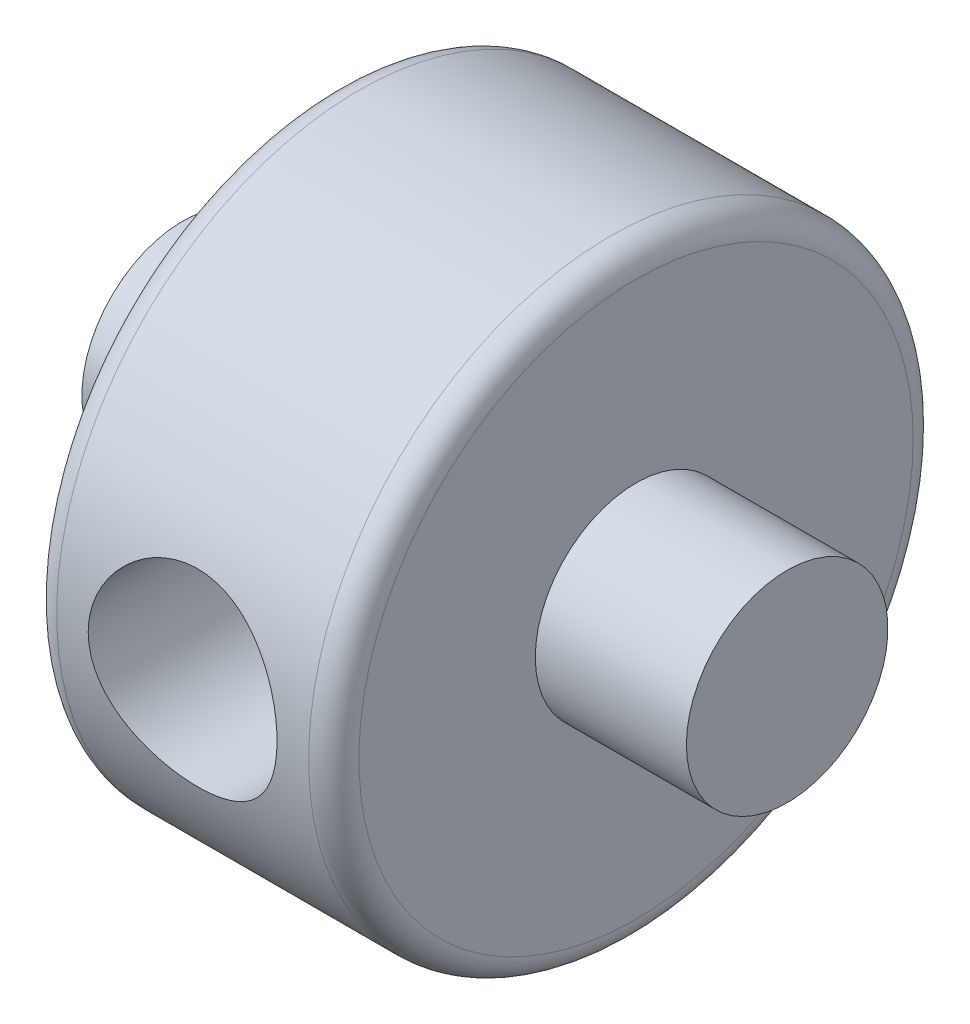
ISO-10303-21;
HEADER;
FILE_DESCRIPTION(('STEP AP214'),'2;1');
FILE_NAME('part.step','',(''),(''),'','','');
FILE_SCHEMA(('AUTOMOTIVE_DESIGN { 1 0 10303 214 1 1 1 1 }'));
ENDSEC;
DATA;
#1=APPLICATION_CONTEXT('core data for automotive mechanical design processes');
#2=APPLICATION_PROTOCOL_DEFINITION('international standard','automotive_design',2000,#1);
#3=PRODUCT_CONTEXT('',#1,'mechanical');
#4=PRODUCT('Part','Part','',(#3));
#5=PRODUCT_RELATED_PRODUCT_CATEGORY('part','',(#4));
#6=PRODUCT_DEFINITION_FORMATION('','',#4);
#7=PRODUCT_DEFINITION_CONTEXT('part definition',#1,'design');
#8=PRODUCT_DEFINITION('design','',#6,#7);
#9=PRODUCT_DEFINITION_SHAPE('','',#8);
#10=(LENGTH_UNIT() NAMED_UNIT(*) SI_UNIT(.MILLI.,.METRE.));
#11=(NAMED_UNIT(*) PLANE_ANGLE_UNIT() SI_UNIT($,.RADIAN.));
#12=(NAMED_UNIT(*) SI_UNIT($,.STERADIAN.) SOLID_ANGLE_UNIT());
#13=UNCERTAINTY_MEASURE_WITH_UNIT(LENGTH_MEASURE(1.E-05),#10,'distance_accuracy_value','');
#14=(GEOMETRIC_REPRESENTATION_CONTEXT(3) GLOBAL_UNCERTAINTY_ASSIGNED_CONTEXT((#13)) GLOBAL_UNIT_ASSIGNED_CONTEXT((#10,
#11,#12)) REPRESENTATION_CONTEXT('',''));
#15=CARTESIAN_POINT('',(0.,0.,0.));
#16=DIRECTION('',(0.,0.,1.));
#17=DIRECTION('',(1.,0.,0.));
#18=AXIS2_PLACEMENT_3D('',#15,#16,#17);
#19=CARTESIAN_POINT('',(4.7625,0.,0.));
#20=DIRECTION('',(-1.,0.,0.));
#21=DIRECTION('',(0.,0.,1.));
#22=AXIS2_PLACEMENT_3D('',#19,#20,#21);
#23=CYLINDRICAL_SURFACE('',#22,9.525);
#24=CARTESIAN_POINT('',(-3.97002,0.,0.));
#25=DIRECTION('',(1.,0.,0.));
#26=DIRECTION('',(0.,0.,-1.));
#27=AXIS2_PLACEMENT_3D('',#24,#25,#26);
#28=CIRCLE('',#27,9.525);
#29=CARTESIAN_POINT('',(-3.97002,0.,-9.525));
#30=VERTEX_POINT('',#29);
#31=EDGE_CURVE('E66',#30,#30,#28,.T.);
#32=ORIENTED_EDGE('',*,*,#31,.T.);
#33=EDGE_LOOP('',(#32));
#34=FACE_BOUND('',#33,.T.);
#35=CARTESIAN_POINT('',(3.97002,0.,0.));
#36=DIRECTION('',(1.,0.,0.));
#37=DIRECTION('',(0.,0.,-1.));
#38=AXIS2_PLACEMENT_3D('',#35,#36,#37);
#39=CIRCLE('',#38,9.525);
#40=CARTESIAN_POINT('',(3.97002,0.,-9.525));
#41=VERTEX_POINT('',#40);
#42=EDGE_CURVE('E70',#41,#41,#39,.F.);
#43=ORIENTED_EDGE('',*,*,#42,.T.);
#44=EDGE_LOOP('',(#43));
#45=FACE_BOUND('',#44,.T.);
#46=CARTESIAN_POINT('',(-2.97561,0.,9.525));
#47=CARTESIAN_POINT('',(-2.97560892908899,-0.162921268693524,9.5249991825274));
#48=CARTESIAN_POINT('',(-2.96218545551913,-0.325853755817803,9.5207804866991));
#49=CARTESIAN_POINT('',(-2.9089868638568,-0.64695408256915,9.5043645830204));
#50=CARTESIAN_POINT('',(-2.86920576572283,-0.805120832425698,9.49216556459521));
#51=CARTESIAN_POINT('',(-2.76476421151836,-1.1120129201775,9.46112170079366));
#52=CARTESIAN_POINT('',(-2.7001422506502,-1.26075245376864,9.44228714208394));
#53=CARTESIAN_POINT('',(-2.54801708251173,-1.54528445019378,9.39991699927325));
#54=CARTESIAN_POINT('',(-2.46051027418793,-1.68107487082232,9.37638067546209));
#55=CARTESIAN_POINT('',(-2.26225609825942,-1.94004612503259,9.326292844634));
#56=CARTESIAN_POINT('',(-2.15092999331535,-2.06277116216999,9.29967567946985));
#57=CARTESIAN_POINT('',(-1.9094296343454,-2.28814818724141,9.24680648901886));
#58=CARTESIAN_POINT('',(-1.77925188196652,-2.39079644114151,9.22055453249807));
#59=CARTESIAN_POINT('',(-1.49979833405859,-2.57557701781646,9.17068363841349));
#60=CARTESIAN_POINT('',(-1.35013027047282,-2.65714004001138,9.14714574209272));
#61=CARTESIAN_POINT('',(-1.03834767478036,-2.79374911714824,9.10635549526321));
#62=CARTESIAN_POINT('',(-0.876236432006404,-2.84880215216098,9.08910149049978));
#63=CARTESIAN_POINT('',(-0.549312310322734,-2.92916088653537,9.06351935862837));
#64=CARTESIAN_POINT('',(-0.384727596585018,-2.95531204167687,9.05493821293298));
#65=CARTESIAN_POINT('',(-0.0533002371303596,-2.97976597917009,9.0469221577123));
#66=CARTESIAN_POINT('',(0.1135417969822,-2.97807615961433,9.04748481843225));
#67=CARTESIAN_POINT('',(0.437755018688408,-2.94755740100725,9.05746945847797));
#68=CARTESIAN_POINT('',(0.595239987861666,-2.91980310528962,9.06654061304928));
#69=CARTESIAN_POINT('',(0.903195753586682,-2.83968557156473,9.09195024490162));
#70=CARTESIAN_POINT('',(1.05366580325522,-2.78731971969601,9.10828949407816));
#71=CARTESIAN_POINT('',(1.34588103762239,-2.65870635431721,9.14666326425695));
#72=CARTESIAN_POINT('',(1.48746675040612,-2.58212130582152,9.16877745919686));
#73=CARTESIAN_POINT('',(1.75612984594173,-2.40747793818329,9.21617289096187));
#74=CARTESIAN_POINT('',(1.88320344888501,-2.30941404400202,9.24145494930564));
#75=CARTESIAN_POINT('',(2.12531069615131,-2.08932283958016,9.29374498729017));
#76=CARTESIAN_POINT('',(2.23953365697596,-1.96640834370661,9.32077916124985));
#77=CARTESIAN_POINT('',(2.44594281593567,-1.70283268275949,9.37251295885174));
#78=CARTESIAN_POINT('',(2.53812738356181,-1.56217020577834,9.39721240967794));
#79=CARTESIAN_POINT('',(2.69839182978221,-1.26552983986233,9.44175288357981));
#80=CARTESIAN_POINT('',(2.76627845541765,-1.10944123981617,9.46155458459764));
#81=CARTESIAN_POINT('',(2.87459049380546,-0.787297276370402,9.4937845850159));
#82=CARTESIAN_POINT('',(2.91502423947373,-0.621244953982465,9.50621512167911));
#83=CARTESIAN_POINT('',(2.96590203079995,-0.290768535460987,9.52194225762391));
#84=CARTESIAN_POINT('',(2.97744355636338,-0.126529051992868,9.52557294304818));
#85=CARTESIAN_POINT('',(2.97330347449539,0.201557483831692,9.52427930671778));
#86=CARTESIAN_POINT('',(2.95762584105002,0.365404589977774,9.51935623380823));
#87=CARTESIAN_POINT('',(2.90037356088732,0.683822935801493,9.50172775701694));
#88=CARTESIAN_POINT('',(2.85945185430202,0.838523489496811,9.48921869933119));
#89=CARTESIAN_POINT('',(2.75366967613841,1.1388197218032,9.45788170767091));
#90=CARTESIAN_POINT('',(2.68880624862798,1.28441427355727,9.43905299347461));
#91=CARTESIAN_POINT('',(2.53521465690171,1.56631197910014,9.39644202198593));
#92=CARTESIAN_POINT('',(2.44594343349672,1.70230223515319,9.37255022960303));
#93=CARTESIAN_POINT('',(2.24672195616173,1.95774025593457,9.32254508924183));
#94=CARTESIAN_POINT('',(2.13676609718477,2.07718352155072,9.29643114016449));
#95=CARTESIAN_POINT('',(1.89413482281894,2.30104645806901,9.24362343594829));
#96=CARTESIAN_POINT('',(1.76073217446023,2.40468394628017,9.21694766782538));
#97=CARTESIAN_POINT('',(1.47784950027834,2.58817177210595,9.16711857929308));
#98=CARTESIAN_POINT('',(1.32836973137667,2.66802248976982,9.14396520260813));
#99=CARTESIAN_POINT('',(1.01788607945972,2.8011734002445,9.10405924250885));
#100=CARTESIAN_POINT('',(0.856929737003459,2.85457658511119,9.08728188993928));
#101=CARTESIAN_POINT('',(0.527677948818312,2.93333159164955,9.0621704134104));
#102=CARTESIAN_POINT('',(0.359385318814466,2.95869407873132,9.05383307935257));
#103=CARTESIAN_POINT('',(0.0284146185817938,2.97988222921441,9.04687995933718));
#104=CARTESIAN_POINT('',(-0.134173453040671,2.97699099324848,9.04784184137313));
#105=CARTESIAN_POINT('',(-0.456426000800429,2.94485093082836,9.05835290591848));
#106=CARTESIAN_POINT('',(-0.61609061280295,2.91560333245156,9.06790168832033));
#107=CARTESIAN_POINT('',(-0.925671104369186,2.83243941969344,9.0942156377694));
#108=CARTESIAN_POINT('',(-1.07569539009698,2.77889004918722,9.11087324977955));
#109=CARTESIAN_POINT('',(-1.36474955060592,2.64893161193132,9.1495005696249));
#110=CARTESIAN_POINT('',(-1.50377718271353,2.57251789731425,9.17147135734895));
#111=CARTESIAN_POINT('',(-1.77277605014682,2.39550550144522,9.21932128510671));
#112=CARTESIAN_POINT('',(-1.90218062857498,2.29407800552668,9.24531965309969));
#113=CARTESIAN_POINT('',(-2.14254825469236,2.07137589462194,9.29774676632117));
#114=CARTESIAN_POINT('',(-2.25350635485266,1.95009597227206,9.32417562493132));
#115=CARTESIAN_POINT('',(-2.45745487752511,1.68637097013274,9.37552022631019));
#116=CARTESIAN_POINT('',(-2.54974101061028,1.54336447092973,9.40035847417778));
#117=CARTESIAN_POINT('',(-2.70884066788852,1.24309174405794,9.44475128447266));
#118=CARTESIAN_POINT('',(-2.77566422147912,1.08583116117471,9.46430792637385));
#119=CARTESIAN_POINT('',(-2.87707971583138,0.775274088322703,9.49456798015985));
#120=CARTESIAN_POINT('',(-2.91392217405338,0.622769930704498,9.50588093250502));
#121=CARTESIAN_POINT('',(-2.96318536416659,0.313513400907386,9.52109658709757));
#122=CARTESIAN_POINT('',(-2.97561103042432,0.156761893564039,9.52500078656737));
#123=CARTESIAN_POINT('',(-2.97561,0.,9.525));
#124=B_SPLINE_CURVE_WITH_KNOTS('',3,(#46,#47,#48,#49,#50,#51,#52,#53,#54,#55,#56,#57,#58,#59,
#60,#61,#62,#63,#64,#65,#66,#67,#68,#69,#70,#71,#72,#73,#74,#75,#76,#77,#78,#79,#80,#81,#82,#83,
#84,#85,#86,#87,#88,#89,#90,#91,#92,#93,#94,#95,#96,#97,#98,#99,#100,#101,#102,#103,#104,#105,
#106,#107,#108,#109,#110,#111,#112,#113,#114,#115,#116,#117,#118,#119,#120,#121,#122,#123),
.UNSPECIFIED.,.T.,.F.,(4,2,2,2,2,2,2,2,2,2,2,2,2,2,2,2,2,2,2,2,2,2,2,2,2,2,2,2,2,2,2,2,2,2,2,2,
2,2,4),(0.,0.48818760348454,0.976486005355122,1.46403073545406,1.95165222953998,
2.45283699364851,2.95411488348424,3.46777301296802,3.9812958223854,4.47936276908504,
4.97729736819423,5.45556333934905,5.93388011605119,6.41918085331817,6.90460770459774,
7.412117184402,7.91966420064632,8.43116268893267,8.9425058499212,9.4341088402017,
9.92564006268288,10.4049619292838,10.8843429945151,11.3754065240728,11.8666033124105,
12.3772503337256,12.8878891958236,13.3965235759112,13.9049644279144,14.3904265009165,
14.8758659549335,15.3542076044564,15.8326465574799,16.3297925923838,16.8270717524275,
17.3405744711146,17.8538747177861,18.3237009362114,18.7934321981296),.UNSPECIFIED.);
#125=CARTESIAN_POINT('',(-2.97561,0.,9.525));
#126=VERTEX_POINT('',#125);
#127=EDGE_CURVE('E10',#126,#126,#124,.T.);
#128=ORIENTED_EDGE('',*,*,#127,.F.);
#129=EDGE_LOOP('',(#128));
#130=FACE_BOUND('',#129,.T.);
#131=ADVANCED_FACE('F37',(#34,#45,#130),#23,.T.);
#132=CARTESIAN_POINT('',(4.7625,0.,0.));
#133=DIRECTION('',(1.,0.,0.));
#134=DIRECTION('',(0.,0.,-1.));
#135=AXIS2_PLACEMENT_3D('',#132,#133,#134);
#136=PLANE('',#135);
#137=CARTESIAN_POINT('',(4.7625,0.,0.));
#138=DIRECTION('',(1.,0.,0.));
#139=DIRECTION('',(0.,0.,-1.));
#140=AXIS2_PLACEMENT_3D('',#137,#138,#139);
#141=CIRCLE('',#140,8.73252);
#142=CARTESIAN_POINT('',(4.7625,0.,-8.73252));
#143=VERTEX_POINT('',#142);
#144=EDGE_CURVE('E55',#143,#143,#141,.T.);
#145=ORIENTED_EDGE('',*,*,#144,.T.);
#146=EDGE_LOOP('',(#145));
#147=FACE_BOUND('',#146,.T.);
#148=CARTESIAN_POINT('',(4.7625,0.,0.));
#149=DIRECTION('',(1.,0.,0.));
#150=DIRECTION('',(0.,0.,-1.));
#151=AXIS2_PLACEMENT_3D('',#148,#149,#150);
#152=CIRCLE('',#151,3.175);
#153=CARTESIAN_POINT('',(4.7625,0.,3.175));
#154=VERTEX_POINT('',#153);
#155=EDGE_CURVE('E74',#154,#154,#152,.T.);
#156=ORIENTED_EDGE('',*,*,#155,.F.);
#157=EDGE_LOOP('',(#156));
#158=FACE_BOUND('',#157,.T.);
#159=ADVANCED_FACE('F106',(#147,#158),#136,.T.);
#160=CARTESIAN_POINT('',(-4.7625,0.,0.));
#161=DIRECTION('',(1.,0.,0.));
#162=DIRECTION('',(0.,0.,-1.));
#163=AXIS2_PLACEMENT_3D('',#160,#161,#162);
#164=PLANE('',#163);
#165=CARTESIAN_POINT('',(-4.7625,0.,0.));
#166=DIRECTION('',(1.,0.,0.));
#167=DIRECTION('',(0.,0.,-1.));
#168=AXIS2_PLACEMENT_3D('',#165,#166,#167);
#169=CIRCLE('',#168,3.175);
#170=CARTESIAN_POINT('',(-4.7625,0.,-3.175));
#171=VERTEX_POINT('',#170);
#172=EDGE_CURVE('E50',#171,#171,#169,.F.);
#173=ORIENTED_EDGE('',*,*,#172,.F.);
#174=EDGE_LOOP('',(#173));
#175=FACE_BOUND('',#174,.T.);
#176=CARTESIAN_POINT('',(-4.7625,0.,0.));
#177=DIRECTION('',(1.,0.,0.));
#178=DIRECTION('',(0.,0.,-1.));
#179=AXIS2_PLACEMENT_3D('',#176,#177,#178);
#180=CIRCLE('',#179,8.73252);
#181=CARTESIAN_POINT('',(-4.7625,0.,-8.73252));
#182=VERTEX_POINT('',#181);
#183=EDGE_CURVE('E60',#182,#182,#180,.F.);
#184=ORIENTED_EDGE('',*,*,#183,.T.);
#185=EDGE_LOOP('',(#184));
#186=FACE_BOUND('',#185,.T.);
#187=ADVANCED_FACE('F111',(#175,#186),#164,.F.);
#188=CARTESIAN_POINT('',(9.525,0.,0.));
#189=DIRECTION('',(-1.,0.,0.));
#190=DIRECTION('',(0.,0.,1.));
#191=AXIS2_PLACEMENT_3D('',#188,#189,#190);
#192=CYLINDRICAL_SURFACE('',#191,3.175);
#193=CARTESIAN_POINT('',(9.525,0.,0.));
#194=DIRECTION('',(1.,0.,0.));
#195=DIRECTION('',(0.,0.,-1.));
#196=AXIS2_PLACEMENT_3D('',#193,#194,#195);
#197=CIRCLE('',#196,3.175);
#198=CARTESIAN_POINT('',(9.525,0.,3.175));
#199=VERTEX_POINT('',#198);
#200=EDGE_CURVE('E78',#199,#199,#197,.T.);
#201=CARTESIAN_POINT('',(9.525,0.,3.175));
#202=CARTESIAN_POINT('',(9.475390625,0.,3.175));
#203=CARTESIAN_POINT('',(9.42578125,0.,3.175));
#204=CARTESIAN_POINT('',(9.3265625,0.,3.175));
#205=CARTESIAN_POINT('',(9.276953125,0.,3.175));
#206=CARTESIAN_POINT('',(9.177734375,0.,3.175));
#207=CARTESIAN_POINT('',(9.128125,0.,3.175));
#208=CARTESIAN_POINT('',(9.02890625,0.,3.175));
#209=CARTESIAN_POINT('',(8.979296875,0.,3.175));
#210=CARTESIAN_POINT('',(8.880078125,0.,3.175));
#211=CARTESIAN_POINT('',(8.83046875,0.,3.175));
#212=CARTESIAN_POINT('',(8.73125,0.,3.175));
#213=CARTESIAN_POINT('',(8.681640625,0.,3.175));
#214=CARTESIAN_POINT('',(8.582421875,0.,3.175));
#215=CARTESIAN_POINT('',(8.5328125,0.,3.175));
#216=CARTESIAN_POINT('',(8.43359375,0.,3.175));
#217=CARTESIAN_POINT('',(8.383984375,0.,3.175));
#218=CARTESIAN_POINT('',(8.284765625,0.,3.175));
#219=CARTESIAN_POINT('',(8.23515625,0.,3.175));
#220=CARTESIAN_POINT('',(8.1359375,0.,3.175));
#221=CARTESIAN_POINT('',(8.086328125,0.,3.175));
#222=CARTESIAN_POINT('',(7.987109375,0.,3.175));
#223=CARTESIAN_POINT('',(7.9375,0.,3.175));
#224=CARTESIAN_POINT('',(7.83828125,0.,3.175));
#225=CARTESIAN_POINT('',(7.788671875,0.,3.175));
#226=CARTESIAN_POINT('',(7.689453125,0.,3.175));
#227=CARTESIAN_POINT('',(7.63984375,0.,3.175));
#228=CARTESIAN_POINT('',(7.540625,0.,3.175));
#229=CARTESIAN_POINT('',(7.491015625,0.,3.175));
#230=CARTESIAN_POINT('',(7.391796875,0.,3.175));
#231=CARTESIAN_POINT('',(7.3421875,0.,3.175));
#232=CARTESIAN_POINT('',(7.24296875,0.,3.175));
#233=CARTESIAN_POINT('',(7.193359375,0.,3.175));
#234=CARTESIAN_POINT('',(7.094140625,0.,3.175));
#235=CARTESIAN_POINT('',(7.04453125,0.,3.175));
#236=CARTESIAN_POINT('',(6.9453125,0.,3.175));
#237=CARTESIAN_POINT('',(6.895703125,0.,3.175));
#238=CARTESIAN_POINT('',(6.796484375,0.,3.175));
#239=CARTESIAN_POINT('',(6.746875,0.,3.175));
#240=CARTESIAN_POINT('',(6.64765625,0.,3.175));
#241=CARTESIAN_POINT('',(6.598046875,0.,3.175));
#242=CARTESIAN_POINT('',(6.498828125,0.,3.175));
#243=CARTESIAN_POINT('',(6.44921875,0.,3.175));
#244=CARTESIAN_POINT('',(6.35,0.,3.175));
#245=CARTESIAN_POINT('',(6.300390625,0.,3.175));
#246=CARTESIAN_POINT('',(6.201171875,0.,3.175));
#247=CARTESIAN_POINT('',(6.1515625,0.,3.175));
#248=CARTESIAN_POINT('',(6.05234375,0.,3.175));
#249=CARTESIAN_POINT('',(6.002734375,0.,3.175));
#250=CARTESIAN_POINT('',(5.903515625,0.,3.175));
#251=CARTESIAN_POINT('',(5.85390625,0.,3.175));
#252=CARTESIAN_POINT('',(5.7546875,0.,3.175));
#253=CARTESIAN_POINT('',(5.705078125,0.,3.175));
#254=CARTESIAN_POINT('',(5.605859375,0.,3.175));
#255=CARTESIAN_POINT('',(5.55625,0.,3.175));
#256=CARTESIAN_POINT('',(5.45703125,0.,3.175));
#257=CARTESIAN_POINT('',(5.407421875,0.,3.175));
#258=CARTESIAN_POINT('',(5.308203125,0.,3.175));
#259=CARTESIAN_POINT('',(5.25859375,0.,3.175));
#260=CARTESIAN_POINT('',(5.159375,0.,3.175));
#261=CARTESIAN_POINT('',(5.109765625,0.,3.175));
#262=CARTESIAN_POINT('',(5.010546875,0.,3.175));
#263=CARTESIAN_POINT('',(4.9609375,0.,3.175));
#264=CARTESIAN_POINT('',(4.86171875,0.,3.175));
#265=CARTESIAN_POINT('',(4.812109375,0.,3.175));
#266=CARTESIAN_POINT('',(4.7625,0.,3.175));
#267=B_SPLINE_CURVE_WITH_KNOTS('',3,(#201,#202,#203,#204,#205,#206,#207,#208,#209,#210,#211,
#212,#213,#214,#215,#216,#217,#218,#219,#220,#221,#222,#223,#224,#225,#226,#227,#228,#229,#230,
#231,#232,#233,#234,#235,#236,#237,#238,#239,#240,#241,#242,#243,#244,#245,#246,#247,#248,#249,
#250,#251,#252,#253,#254,#255,#256,#257,#258,#259,#260,#261,#262,#263,#264,#265,#266),
.UNSPECIFIED.,.F.,.F.,(4,2,2,2,2,2,2,2,2,2,2,2,2,2,2,2,2,2,2,2,2,2,2,2,2,2,2,2,2,2,2,2,4),(0.,
0.148828125,0.29765625,0.446484375,0.5953125,0.744140625,0.892968750000001,1.041796875,1.190625,
1.339453125,1.48828125,1.637109375,1.7859375,1.934765625,2.08359375,2.232421875,2.38125,
2.530078125,2.67890625,2.827734375,2.9765625,3.125390625,3.27421875,3.423046875,3.571875,
3.720703125,3.86953125,4.018359375,4.1671875,4.316015625,4.46484375,4.613671875,4.7625),.UNSPECIFIED.);
#268=EDGE_CURVE('BSEAM126',#199,#154,#267,.T.);
#269=ORIENTED_EDGE('',*,*,#200,.F.);
#270=ORIENTED_EDGE('',*,*,#155,.T.);
#271=ORIENTED_EDGE('',*,*,#268,.T.);
#272=ORIENTED_EDGE('',*,*,#268,.F.);
#273=EDGE_LOOP('',(#269,#271,#270,#272));
#274=FACE_BOUND('',#273,.T.);
#275=ADVANCED_FACE('F126',(#274),#192,.T.);
#276=CARTESIAN_POINT('',(9.525,0.,0.));
#277=DIRECTION('',(1.,0.,0.));
#278=DIRECTION('',(0.,0.,-1.));
#279=AXIS2_PLACEMENT_3D('',#276,#277,#278);
#280=PLANE('',#279);
#281=ORIENTED_EDGE('',*,*,#200,.T.);
#282=EDGE_LOOP('',(#281));
#283=FACE_BOUND('',#282,.T.);
#284=ADVANCED_FACE('F119',(#283),#280,.T.);
#285=CARTESIAN_POINT('',(-3.97002,0.,0.));
#286=DIRECTION('',(1.,0.,0.));
#287=DIRECTION('',(0.,0.,-1.));
#288=AXIS2_PLACEMENT_3D('',#285,#286,#287);
#289=TOROIDAL_SURFACE('',#288,8.73252,0.79248);
#290=ORIENTED_EDGE('',*,*,#183,.F.);
#291=EDGE_LOOP('',(#290));
#292=FACE_BOUND('',#291,.T.);
#293=ORIENTED_EDGE('',*,*,#31,.F.);
#294=EDGE_LOOP('',(#293));
#295=FACE_BOUND('',#294,.T.);
#296=ADVANCED_FACE('F117',(#292,#295),#289,.T.);
#297=CARTESIAN_POINT('',(3.97002,0.,0.));
#298=DIRECTION('',(1.,0.,0.));
#299=DIRECTION('',(0.,0.,-1.));
#300=AXIS2_PLACEMENT_3D('',#297,#298,#299);
#301=TOROIDAL_SURFACE('',#300,8.73252,0.79248);
#302=ORIENTED_EDGE('',*,*,#42,.F.);
#303=EDGE_LOOP('',(#302));
#304=FACE_BOUND('',#303,.T.);
#305=ORIENTED_EDGE('',*,*,#144,.F.);
#306=EDGE_LOOP('',(#305));
#307=FACE_BOUND('',#306,.T.);
#308=ADVANCED_FACE('F39',(#304,#307),#301,.T.);
#309=CARTESIAN_POINT('',(-9.525,0.,0.));
#310=DIRECTION('',(1.,0.,0.));
#311=DIRECTION('',(0.,0.,-1.));
#312=AXIS2_PLACEMENT_3D('',#309,#310,#311);
#313=CYLINDRICAL_SURFACE('',#312,3.175);
#314=CARTESIAN_POINT('',(-9.525,0.,0.));
#315=DIRECTION('',(-1.,0.,0.));
#316=DIRECTION('',(0.,0.,1.));
#317=AXIS2_PLACEMENT_3D('',#314,#315,#316);
#318=CIRCLE('',#317,3.175);
#319=CARTESIAN_POINT('',(-9.525,0.,-3.175));
#320=VERTEX_POINT('',#319);
#321=EDGE_CURVE('E82',#320,#320,#318,.T.);
#322=CARTESIAN_POINT('',(-9.525,0.,-3.175));
#323=CARTESIAN_POINT('',(-9.475390625,0.,-3.175));
#324=CARTESIAN_POINT('',(-9.42578125,0.,-3.175));
#325=CARTESIAN_POINT('',(-9.3265625,0.,-3.175));
#326=CARTESIAN_POINT('',(-9.276953125,0.,-3.175));
#327=CARTESIAN_POINT('',(-9.177734375,0.,-3.175));
#328=CARTESIAN_POINT('',(-9.128125,0.,-3.175));
#329=CARTESIAN_POINT('',(-9.02890625,0.,-3.175));
#330=CARTESIAN_POINT('',(-8.979296875,0.,-3.175));
#331=CARTESIAN_POINT('',(-8.880078125,0.,-3.175));
#332=CARTESIAN_POINT('',(-8.83046875,0.,-3.175));
#333=CARTESIAN_POINT('',(-8.73125,0.,-3.175));
#334=CARTESIAN_POINT('',(-8.681640625,0.,-3.175));
#335=CARTESIAN_POINT('',(-8.582421875,0.,-3.175));
#336=CARTESIAN_POINT('',(-8.5328125,0.,-3.175));
#337=CARTESIAN_POINT('',(-8.43359375,0.,-3.175));
#338=CARTESIAN_POINT('',(-8.383984375,0.,-3.175));
#339=CARTESIAN_POINT('',(-8.284765625,0.,-3.175));
#340=CARTESIAN_POINT('',(-8.23515625,0.,-3.175));
#341=CARTESIAN_POINT('',(-8.1359375,0.,-3.175));
#342=CARTESIAN_POINT('',(-8.086328125,0.,-3.175));
#343=CARTESIAN_POINT('',(-7.987109375,0.,-3.175));
#344=CARTESIAN_POINT('',(-7.9375,0.,-3.175));
#345=CARTESIAN_POINT('',(-7.83828125,0.,-3.175));
#346=CARTESIAN_POINT('',(-7.788671875,0.,-3.175));
#347=CARTESIAN_POINT('',(-7.689453125,0.,-3.175));
#348=CARTESIAN_POINT('',(-7.63984375,0.,-3.175));
#349=CARTESIAN_POINT('',(-7.540625,0.,-3.175));
#350=CARTESIAN_POINT('',(-7.491015625,0.,-3.175));
#351=CARTESIAN_POINT('',(-7.391796875,0.,-3.175));
#352=CARTESIAN_POINT('',(-7.3421875,0.,-3.175));
#353=CARTESIAN_POINT('',(-7.24296875,0.,-3.175));
#354=CARTESIAN_POINT('',(-7.193359375,0.,-3.175));
#355=CARTESIAN_POINT('',(-7.094140625,0.,-3.175));
#356=CARTESIAN_POINT('',(-7.04453125,0.,-3.175));
#357=CARTESIAN_POINT('',(-6.9453125,0.,-3.175));
#358=CARTESIAN_POINT('',(-6.895703125,0.,-3.175));
#359=CARTESIAN_POINT('',(-6.796484375,0.,-3.175));
#360=CARTESIAN_POINT('',(-6.746875,0.,-3.175));
#361=CARTESIAN_POINT('',(-6.64765625,0.,-3.175));
#362=CARTESIAN_POINT('',(-6.598046875,0.,-3.175));
#363=CARTESIAN_POINT('',(-6.498828125,0.,-3.175));
#364=CARTESIAN_POINT('',(-6.44921875,0.,-3.175));
#365=CARTESIAN_POINT('',(-6.35,0.,-3.175));
#366=CARTESIAN_POINT('',(-6.300390625,0.,-3.175));
#367=CARTESIAN_POINT('',(-6.201171875,0.,-3.175));
#368=CARTESIAN_POINT('',(-6.1515625,0.,-3.175));
#369=CARTESIAN_POINT('',(-6.05234375,0.,-3.175));
#370=CARTESIAN_POINT('',(-6.002734375,0.,-3.175));
#371=CARTESIAN_POINT('',(-5.903515625,0.,-3.175));
#372=CARTESIAN_POINT('',(-5.85390625,0.,-3.175));
#373=CARTESIAN_POINT('',(-5.7546875,0.,-3.175));
#374=CARTESIAN_POINT('',(-5.705078125,0.,-3.175));
#375=CARTESIAN_POINT('',(-5.605859375,0.,-3.175));
#376=CARTESIAN_POINT('',(-5.55625,0.,-3.175));
#377=CARTESIAN_POINT('',(-5.45703125,0.,-3.175));
#378=CARTESIAN_POINT('',(-5.407421875,0.,-3.175));
#379=CARTESIAN_POINT('',(-5.308203125,0.,-3.175));
#380=CARTESIAN_POINT('',(-5.25859375,0.,-3.175));
#381=CARTESIAN_POINT('',(-5.159375,0.,-3.175));
#382=CARTESIAN_POINT('',(-5.109765625,0.,-3.175));
#383=CARTESIAN_POINT('',(-5.010546875,0.,-3.175));
#384=CARTESIAN_POINT('',(-4.9609375,0.,-3.175));
#385=CARTESIAN_POINT('',(-4.86171875,0.,-3.175));
#386=CARTESIAN_POINT('',(-4.812109375,0.,-3.175));
#387=CARTESIAN_POINT('',(-4.7625,0.,-3.175));
#388=B_SPLINE_CURVE_WITH_KNOTS('',3,(#322,#323,#324,#325,#326,#327,#328,#329,#330,#331,#332,
#333,#334,#335,#336,#337,#338,#339,#340,#341,#342,#343,#344,#345,#346,#347,#348,#349,#350,#351,
#352,#353,#354,#355,#356,#357,#358,#359,#360,#361,#362,#363,#364,#365,#366,#367,#368,#369,#370,
#371,#372,#373,#374,#375,#376,#377,#378,#379,#380,#381,#382,#383,#384,#385,#386,#387),
.UNSPECIFIED.,.F.,.F.,(4,2,2,2,2,2,2,2,2,2,2,2,2,2,2,2,2,2,2,2,2,2,2,2,2,2,2,2,2,2,2,2,4),(0.,
0.148828125,0.29765625,0.446484375,0.5953125,0.744140625,0.892968750000001,1.041796875,1.190625,
1.339453125,1.48828125,1.637109375,1.7859375,1.934765625,2.08359375,2.232421875,2.38125,
2.530078125,2.67890625,2.827734375,2.9765625,3.125390625,3.27421875,3.423046875,3.571875,
3.720703125,3.86953125,4.018359375,4.1671875,4.316015625,4.46484375,4.613671875,4.7625),.UNSPECIFIED.);
#389=EDGE_CURVE('BSEAM101',#320,#171,#388,.T.);
#390=ORIENTED_EDGE('',*,*,#321,.F.);
#391=ORIENTED_EDGE('',*,*,#172,.T.);
#392=ORIENTED_EDGE('',*,*,#389,.T.);
#393=ORIENTED_EDGE('',*,*,#389,.F.);
#394=EDGE_LOOP('',(#390,#392,#391,#393));
#395=FACE_BOUND('',#394,.T.);
#396=ADVANCED_FACE('F101',(#395),#313,.T.);
#397=CARTESIAN_POINT('',(-9.525,0.,0.));
#398=DIRECTION('',(-1.,0.,0.));
#399=DIRECTION('',(0.,0.,1.));
#400=AXIS2_PLACEMENT_3D('',#397,#398,#399);
#401=PLANE('',#400);
#402=ORIENTED_EDGE('',*,*,#321,.T.);
#403=EDGE_LOOP('',(#402));
#404=FACE_BOUND('',#403,.T.);
#405=ADVANCED_FACE('F95',(#404),#401,.T.);
#406=CARTESIAN_POINT('',(0.,0.,9.525));
#407=DIRECTION('',(0.,0.,-1.));
#408=DIRECTION('',(-1.,0.,0.));
#409=AXIS2_PLACEMENT_3D('',#406,#407,#408);
#410=CYLINDRICAL_SURFACE('',#409,2.97561);
#411=CARTESIAN_POINT('',(0.,0.,0.));
#412=DIRECTION('',(0.,0.,1.));
#413=DIRECTION('',(1.,0.,0.));
#414=AXIS2_PLACEMENT_3D('',#411,#412,#413);
#415=CIRCLE('',#414,2.97561);
#416=CARTESIAN_POINT('',(2.97561,0.,0.));
#417=VERTEX_POINT('',#416);
#418=EDGE_CURVE('E86',#417,#417,#415,.T.);
#419=ORIENTED_EDGE('',*,*,#418,.F.);
#420=EDGE_LOOP('',(#419));
#421=FACE_BOUND('',#420,.T.);
#422=ORIENTED_EDGE('',*,*,#127,.T.);
#423=EDGE_LOOP('',(#422));
#424=FACE_BOUND('',#423,.T.);
#425=ADVANCED_FACE('F93',(#421,#424),#410,.F.);
#426=CARTESIAN_POINT('',(0.,0.,0.));
#427=DIRECTION('',(0.,0.,1.));
#428=DIRECTION('',(1.,0.,0.));
#429=AXIS2_PLACEMENT_3D('',#426,#427,#428);
#430=PLANE('',#429);
#431=ORIENTED_EDGE('',*,*,#418,.T.);
#432=EDGE_LOOP('',(#431));
#433=FACE_BOUND('',#432,.T.);
#434=ADVANCED_FACE('F91',(#433),#430,.T.);
#435=CLOSED_SHELL('',(#131,#159,#187,#275,#284,#296,#308,#396,#405,#425,#434));
#436=MANIFOLD_SOLID_BREP('B2',#435);
#437=ADVANCED_BREP_SHAPE_REPRESENTATION('',(#18,#436),#14);
#438=SHAPE_DEFINITION_REPRESENTATION(#9,#437);
ENDSEC;
END-ISO-10303-21;
